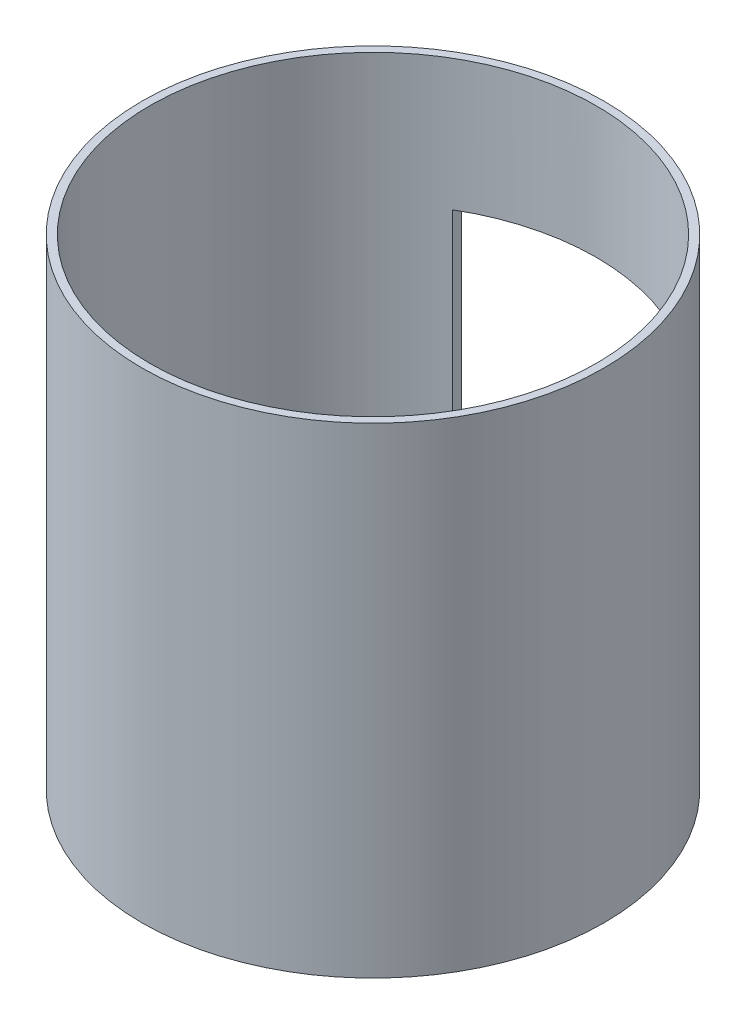
ISO-10303-21;
HEADER;
FILE_DESCRIPTION(('STEP AP214'),'2;1');
FILE_NAME('part.step','',(''),(''),'','','');
FILE_SCHEMA(('AUTOMOTIVE_DESIGN { 1 0 10303 214 1 1 1 1 }'));
ENDSEC;
DATA;
#1=APPLICATION_CONTEXT('core data for automotive mechanical design processes');
#2=APPLICATION_PROTOCOL_DEFINITION('international standard','automotive_design',2000,#1);
#3=PRODUCT_CONTEXT('',#1,'mechanical');
#4=PRODUCT('Part','Part','',(#3));
#5=PRODUCT_RELATED_PRODUCT_CATEGORY('part','',(#4));
#6=PRODUCT_DEFINITION_FORMATION('','',#4);
#7=PRODUCT_DEFINITION_CONTEXT('part definition',#1,'design');
#8=PRODUCT_DEFINITION('design','',#6,#7);
#9=PRODUCT_DEFINITION_SHAPE('','',#8);
#10=(LENGTH_UNIT() NAMED_UNIT(*) SI_UNIT(.MILLI.,.METRE.));
#11=(NAMED_UNIT(*) PLANE_ANGLE_UNIT() SI_UNIT($,.RADIAN.));
#12=(NAMED_UNIT(*) SI_UNIT($,.STERADIAN.) SOLID_ANGLE_UNIT());
#13=UNCERTAINTY_MEASURE_WITH_UNIT(LENGTH_MEASURE(1.E-05),#10,'distance_accuracy_value','');
#14=(GEOMETRIC_REPRESENTATION_CONTEXT(3) GLOBAL_UNCERTAINTY_ASSIGNED_CONTEXT((#13)) GLOBAL_UNIT_ASSIGNED_CONTEXT((#10,
#11,#12)) REPRESENTATION_CONTEXT('',''));
#15=CARTESIAN_POINT('',(0.,0.,0.));
#16=DIRECTION('',(0.,0.,1.));
#17=DIRECTION('',(1.,0.,0.));
#18=AXIS2_PLACEMENT_3D('',#15,#16,#17);
#19=CARTESIAN_POINT('',(0.,0.,0.));
#20=DIRECTION('',(0.,1.,0.));
#21=DIRECTION('',(0.,0.,1.));
#22=AXIS2_PLACEMENT_3D('',#19,#20,#21);
#23=PLANE('',#22);
#24=CARTESIAN_POINT('',(0.,0.,0.));
#25=DIRECTION('',(0.,1.,0.));
#26=DIRECTION('',(0.,0.,1.));
#27=AXIS2_PLACEMENT_3D('',#24,#25,#26);
#28=CIRCLE('',#27,85.);
#29=CARTESIAN_POINT('',(0.,0.,85.));
#30=VERTEX_POINT('',#29);
#31=EDGE_CURVE('E371',#30,#30,#28,.T.);
#32=ORIENTED_EDGE('',*,*,#31,.T.);
#33=EDGE_LOOP('',(#32));
#34=FACE_BOUND('',#33,.T.);
#35=DIRECTION('',(1.,0.,0.));
#36=VECTOR('',#35,1.);
#37=CARTESIAN_POINT('',(0.,0.,27.5926707036758));
#38=LINE('',#37,#36);
#39=CARTESIAN_POINT('',(22.,0.,27.5926707036758));
#40=VERTEX_POINT('',#39);
#41=CARTESIAN_POINT('',(25.,0.,27.5926707036758));
#42=VERTEX_POINT('',#41);
#43=EDGE_CURVE('E11',#40,#42,#38,.T.);
#44=ORIENTED_EDGE('',*,*,#43,.F.);
#45=DIRECTION('',(0.,0.,-1.));
#46=VECTOR('',#45,1.);
#47=CARTESIAN_POINT('',(22.,0.,0.));
#48=LINE('',#47,#46);
#49=CARTESIAN_POINT('',(22.,0.,25.));
#50=VERTEX_POINT('',#49);
#51=EDGE_CURVE('E187',#40,#50,#48,.T.);
#52=ORIENTED_EDGE('',*,*,#51,.T.);
#53=DIRECTION('',(1.,0.,0.));
#54=VECTOR('',#53,1.);
#55=CARTESIAN_POINT('',(25.,0.,25.));
#56=LINE('',#55,#54);
#57=CARTESIAN_POINT('',(-25.,0.,25.));
#58=VERTEX_POINT('',#57);
#59=EDGE_CURVE('E316',#58,#50,#56,.T.);
#60=ORIENTED_EDGE('',*,*,#59,.F.);
#61=DIRECTION('',(0.,0.,1.));
#62=VECTOR('',#61,1.);
#63=CARTESIAN_POINT('',(-25.,0.,25.));
#64=LINE('',#63,#62);
#65=CARTESIAN_POINT('',(-25.,0.,-25.));
#66=VERTEX_POINT('',#65);
#67=EDGE_CURVE('E297',#66,#58,#64,.T.);
#68=ORIENTED_EDGE('',*,*,#67,.F.);
#69=DIRECTION('',(-1.,0.,0.));
#70=VECTOR('',#69,1.);
#71=CARTESIAN_POINT('',(0.,0.,-25.));
#72=LINE('',#71,#70);
#73=CARTESIAN_POINT('',(22.,0.,-25.));
#74=VERTEX_POINT('',#73);
#75=EDGE_CURVE('E303',#74,#66,#72,.T.);
#76=ORIENTED_EDGE('',*,*,#75,.F.);
#77=CARTESIAN_POINT('',(22.,0.,-27.4252060086162));
#78=VERTEX_POINT('',#77);
#79=EDGE_CURVE('E59',#74,#78,#48,.T.);
#80=ORIENTED_EDGE('',*,*,#79,.T.);
#81=DIRECTION('',(-1.,0.,0.));
#82=VECTOR('',#81,1.);
#83=CARTESIAN_POINT('',(0.,0.,-27.4252060086162));
#84=LINE('',#83,#82);
#85=CARTESIAN_POINT('',(25.,0.,-27.4252060086162));
#86=VERTEX_POINT('',#85);
#87=EDGE_CURVE('E52',#86,#78,#84,.T.);
#88=ORIENTED_EDGE('',*,*,#87,.F.);
#89=DIRECTION('',(0.,0.,-1.));
#90=VECTOR('',#89,1.);
#91=CARTESIAN_POINT('',(25.,0.,-25.));
#92=LINE('',#91,#90);
#93=EDGE_CURVE('E320',#42,#86,#92,.T.);
#94=ORIENTED_EDGE('',*,*,#93,.F.);
#95=EDGE_LOOP('',(#44,#52,#60,#68,#76,#80,#88,#94));
#96=FACE_BOUND('',#95,.T.);
#97=ADVANCED_FACE('F43',(#34,#96),#23,.T.);
#98=DIRECTION('',(1.,0.,0.));
#99=VECTOR('',#98,1.);
#100=CARTESIAN_POINT('',(-23.5,0.,23.5));
#101=LINE('',#100,#99);
#102=CARTESIAN_POINT('',(-23.5,0.,23.5));
#103=VERTEX_POINT('',#102);
#104=CARTESIAN_POINT('',(22.,0.,23.5));
#105=VERTEX_POINT('',#104);
#106=EDGE_CURVE('E263',#103,#105,#101,.T.);
#107=ORIENTED_EDGE('',*,*,#106,.T.);
#108=DIRECTION('',(0.,0.,-1.));
#109=VECTOR('',#108,1.);
#110=CARTESIAN_POINT('',(22.,0.,0.));
#111=LINE('',#110,#109);
#112=CARTESIAN_POINT('',(22.,0.,-23.5));
#113=VERTEX_POINT('',#112);
#114=EDGE_CURVE('E400',#105,#113,#111,.T.);
#115=ORIENTED_EDGE('',*,*,#114,.T.);
#116=DIRECTION('',(-1.,0.,0.));
#117=VECTOR('',#116,1.);
#118=CARTESIAN_POINT('',(-23.5,0.,-23.5));
#119=LINE('',#118,#117);
#120=CARTESIAN_POINT('',(-23.5,0.,-23.5));
#121=VERTEX_POINT('',#120);
#122=EDGE_CURVE('E258',#113,#121,#119,.T.);
#123=ORIENTED_EDGE('',*,*,#122,.T.);
#124=DIRECTION('',(0.,0.,1.));
#125=VECTOR('',#124,1.);
#126=CARTESIAN_POINT('',(-23.5,0.,-23.5));
#127=LINE('',#126,#125);
#128=EDGE_CURVE('E276',#121,#103,#127,.T.);
#129=ORIENTED_EDGE('',*,*,#128,.T.);
#130=EDGE_LOOP('',(#107,#115,#123,#129));
#131=FACE_BOUND('',#130,.T.);
#132=ADVANCED_FACE('F447',(#131),#23,.T.);
#133=CARTESIAN_POINT('',(0.,180.,0.));
#134=DIRECTION('',(0.,-1.,0.));
#135=DIRECTION('',(0.,0.,-1.));
#136=AXIS2_PLACEMENT_3D('',#133,#134,#135);
#137=CYLINDRICAL_SURFACE('',#136,88.);
#138=CARTESIAN_POINT('',(0.,130.,0.));
#139=DIRECTION('',(0.,1.,0.));
#140=DIRECTION('',(0.,0.,1.));
#141=AXIS2_PLACEMENT_3D('',#138,#139,#140);
#142=CIRCLE('',#141,88.);
#143=CARTESIAN_POINT('',(43.,130.,-76.7789033524184));
#144=VERTEX_POINT('',#143);
#145=CARTESIAN_POINT('',(-43.,130.,-76.7789033524184));
#146=VERTEX_POINT('',#145);
#147=EDGE_CURVE('E363',#144,#146,#142,.T.);
#148=ORIENTED_EDGE('',*,*,#147,.T.);
#149=DIRECTION('',(0.,-1.,0.));
#150=VECTOR('',#149,1.);
#151=CARTESIAN_POINT('',(-43.,180.,-76.7789033524184));
#152=LINE('',#151,#150);
#153=CARTESIAN_POINT('',(-43.,20.,-76.7789033524184));
#154=VERTEX_POINT('',#153);
#155=EDGE_CURVE('E367',#146,#154,#152,.T.);
#156=ORIENTED_EDGE('',*,*,#155,.T.);
#157=CARTESIAN_POINT('',(0.,20.,0.));
#158=DIRECTION('',(0.,-1.,0.));
#159=DIRECTION('',(0.,0.,-1.));
#160=AXIS2_PLACEMENT_3D('',#157,#158,#159);
#161=CIRCLE('',#160,88.);
#162=CARTESIAN_POINT('',(43.,20.,-76.7789033524184));
#163=VERTEX_POINT('',#162);
#164=EDGE_CURVE('E345',#154,#163,#161,.T.);
#165=ORIENTED_EDGE('',*,*,#164,.T.);
#166=DIRECTION('',(0.,-1.,0.));
#167=VECTOR('',#166,1.);
#168=CARTESIAN_POINT('',(43.,180.,-76.7789033524184));
#169=LINE('',#168,#167);
#170=EDGE_CURVE('E359',#163,#144,#169,.F.);
#171=ORIENTED_EDGE('',*,*,#170,.T.);
#172=EDGE_LOOP('',(#148,#156,#165,#171));
#173=FACE_BOUND('',#172,.T.);
#174=CARTESIAN_POINT('',(0.,180.,0.));
#175=DIRECTION('',(0.,1.,0.));
#176=DIRECTION('',(0.,0.,1.));
#177=AXIS2_PLACEMENT_3D('',#174,#175,#176);
#178=CIRCLE('',#177,88.);
#179=CARTESIAN_POINT('',(0.,180.,88.));
#180=VERTEX_POINT('',#179);
#181=EDGE_CURVE('E383',#180,#180,#178,.T.);
#182=ORIENTED_EDGE('',*,*,#181,.F.);
#183=EDGE_LOOP('',(#182));
#184=FACE_BOUND('',#183,.T.);
#185=CARTESIAN_POINT('',(0.,-3.,0.));
#186=DIRECTION('',(0.,1.,0.));
#187=DIRECTION('',(0.,0.,1.));
#188=AXIS2_PLACEMENT_3D('',#185,#186,#187);
#189=CIRCLE('',#188,88.);
#190=CARTESIAN_POINT('',(0.,-3.,88.));
#191=VERTEX_POINT('',#190);
#192=EDGE_CURVE('E376',#191,#191,#189,.T.);
#193=ORIENTED_EDGE('',*,*,#192,.T.);
#194=EDGE_LOOP('',(#193));
#195=FACE_BOUND('',#194,.T.);
#196=ADVANCED_FACE('F476',(#173,#184,#195),#137,.T.);
#197=CARTESIAN_POINT('',(0.,180.,0.));
#198=DIRECTION('',(0.,1.,0.));
#199=DIRECTION('',(0.,0.,1.));
#200=AXIS2_PLACEMENT_3D('',#197,#198,#199);
#201=PLANE('',#200);
#202=CARTESIAN_POINT('',(0.,180.,0.));
#203=DIRECTION('',(0.,1.,0.));
#204=DIRECTION('',(0.,0.,1.));
#205=AXIS2_PLACEMENT_3D('',#202,#203,#204);
#206=CIRCLE('',#205,85.);
#207=CARTESIAN_POINT('',(0.,180.,85.));
#208=VERTEX_POINT('',#207);
#209=EDGE_CURVE('E372',#208,#208,#206,.T.);
#210=ORIENTED_EDGE('',*,*,#209,.F.);
#211=EDGE_LOOP('',(#210));
#212=FACE_BOUND('',#211,.T.);
#213=ORIENTED_EDGE('',*,*,#181,.T.);
#214=EDGE_LOOP('',(#213));
#215=FACE_BOUND('',#214,.T.);
#216=ADVANCED_FACE('F485',(#212,#215),#201,.T.);
#217=CARTESIAN_POINT('',(0.,-3.,0.));
#218=DIRECTION('',(0.,1.,0.));
#219=DIRECTION('',(0.,0.,1.));
#220=AXIS2_PLACEMENT_3D('',#217,#218,#219);
#221=PLANE('',#220);
#222=ORIENTED_EDGE('',*,*,#192,.F.);
#223=EDGE_LOOP('',(#222));
#224=FACE_BOUND('',#223,.T.);
#225=ADVANCED_FACE('F45',(#224),#221,.F.);
#226=CARTESIAN_POINT('',(0.,180.,0.));
#227=DIRECTION('',(0.,-1.,0.));
#228=DIRECTION('',(0.,0.,-1.));
#229=AXIS2_PLACEMENT_3D('',#226,#227,#228);
#230=CYLINDRICAL_SURFACE('',#229,85.);
#231=DIRECTION('',(0.,-1.,0.));
#232=VECTOR('',#231,1.);
#233=CARTESIAN_POINT('',(-43.,180.,-73.3212111192935));
#234=LINE('',#233,#232);
#235=CARTESIAN_POINT('',(-43.,130.,-73.3212111192934));
#236=VERTEX_POINT('',#235);
#237=CARTESIAN_POINT('',(-43.,20.,-73.3212111192934));
#238=VERTEX_POINT('',#237);
#239=EDGE_CURVE('E396',#236,#238,#234,.T.);
#240=ORIENTED_EDGE('',*,*,#239,.F.);
#241=CARTESIAN_POINT('',(0.,130.,0.));
#242=DIRECTION('',(0.,1.,0.));
#243=DIRECTION('',(0.,0.,1.));
#244=AXIS2_PLACEMENT_3D('',#241,#242,#243);
#245=CIRCLE('',#244,85.);
#246=CARTESIAN_POINT('',(43.,130.,-73.3212111192935));
#247=VERTEX_POINT('',#246);
#248=EDGE_CURVE('E393',#247,#236,#245,.T.);
#249=ORIENTED_EDGE('',*,*,#248,.F.);
#250=DIRECTION('',(0.,-1.,0.));
#251=VECTOR('',#250,1.);
#252=CARTESIAN_POINT('',(43.,180.,-73.3212111192935));
#253=LINE('',#252,#251);
#254=CARTESIAN_POINT('',(43.,20.,-73.3212111192934));
#255=VERTEX_POINT('',#254);
#256=EDGE_CURVE('E390',#255,#247,#253,.F.);
#257=ORIENTED_EDGE('',*,*,#256,.F.);
#258=CARTESIAN_POINT('',(0.,20.,0.));
#259=DIRECTION('',(0.,-1.,0.));
#260=DIRECTION('',(0.,0.,-1.));
#261=AXIS2_PLACEMENT_3D('',#258,#259,#260);
#262=CIRCLE('',#261,85.);
#263=EDGE_CURVE('E387',#238,#255,#262,.T.);
#264=ORIENTED_EDGE('',*,*,#263,.F.);
#265=EDGE_LOOP('',(#240,#249,#257,#264));
#266=FACE_BOUND('',#265,.T.);
#267=ORIENTED_EDGE('',*,*,#209,.T.);
#268=EDGE_LOOP('',(#267));
#269=FACE_BOUND('',#268,.T.);
#270=ORIENTED_EDGE('',*,*,#31,.F.);
#271=EDGE_LOOP('',(#270));
#272=FACE_BOUND('',#271,.T.);
#273=ADVANCED_FACE('F481',(#266,#269,#272),#230,.F.);
#274=CARTESIAN_POINT('',(-43.,130.,-180.));
#275=DIRECTION('',(-1.,0.,0.));
#276=DIRECTION('',(0.,0.,1.));
#277=AXIS2_PLACEMENT_3D('',#274,#275,#276);
#278=PLANE('',#277);
#279=DIRECTION('',(0.,0.,1.));
#280=VECTOR('',#279,1.);
#281=CARTESIAN_POINT('',(-43.,130.,-180.));
#282=LINE('',#281,#280);
#283=EDGE_CURVE('E341',#146,#236,#282,.T.);
#284=ORIENTED_EDGE('',*,*,#283,.T.);
#285=ORIENTED_EDGE('',*,*,#239,.T.);
#286=DIRECTION('',(0.,0.,1.));
#287=VECTOR('',#286,1.);
#288=CARTESIAN_POINT('',(-43.,20.,-180.));
#289=LINE('',#288,#287);
#290=EDGE_CURVE('E340',#154,#238,#289,.T.);
#291=ORIENTED_EDGE('',*,*,#290,.F.);
#292=ORIENTED_EDGE('',*,*,#155,.F.);
#293=EDGE_LOOP('',(#284,#285,#291,#292));
#294=FACE_BOUND('',#293,.T.);
#295=ADVANCED_FACE('F479',(#294),#278,.F.);
#296=CARTESIAN_POINT('',(43.,130.,-180.));
#297=DIRECTION('',(0.,1.,0.));
#298=DIRECTION('',(0.,0.,1.));
#299=AXIS2_PLACEMENT_3D('',#296,#297,#298);
#300=PLANE('',#299);
#301=DIRECTION('',(0.,0.,1.));
#302=VECTOR('',#301,1.);
#303=CARTESIAN_POINT('',(43.,130.,-180.));
#304=LINE('',#303,#302);
#305=EDGE_CURVE('E346',#144,#247,#304,.T.);
#306=ORIENTED_EDGE('',*,*,#305,.T.);
#307=ORIENTED_EDGE('',*,*,#248,.T.);
#308=ORIENTED_EDGE('',*,*,#283,.F.);
#309=ORIENTED_EDGE('',*,*,#147,.F.);
#310=EDGE_LOOP('',(#306,#307,#308,#309));
#311=FACE_BOUND('',#310,.T.);
#312=ADVANCED_FACE('F512',(#311),#300,.F.);
#313=CARTESIAN_POINT('',(43.,20.,-180.));
#314=DIRECTION('',(1.,0.,0.));
#315=DIRECTION('',(0.,0.,-1.));
#316=AXIS2_PLACEMENT_3D('',#313,#314,#315);
#317=PLANE('',#316);
#318=DIRECTION('',(0.,0.,1.));
#319=VECTOR('',#318,1.);
#320=CARTESIAN_POINT('',(43.,20.,-180.));
#321=LINE('',#320,#319);
#322=EDGE_CURVE('E350',#163,#255,#321,.T.);
#323=ORIENTED_EDGE('',*,*,#322,.T.);
#324=ORIENTED_EDGE('',*,*,#256,.T.);
#325=ORIENTED_EDGE('',*,*,#305,.F.);
#326=ORIENTED_EDGE('',*,*,#170,.F.);
#327=EDGE_LOOP('',(#323,#324,#325,#326));
#328=FACE_BOUND('',#327,.T.);
#329=ADVANCED_FACE('F519',(#328),#317,.F.);
#330=CARTESIAN_POINT('',(-43.,20.,-180.));
#331=DIRECTION('',(0.,-1.,0.));
#332=DIRECTION('',(0.,0.,-1.));
#333=AXIS2_PLACEMENT_3D('',#330,#331,#332);
#334=PLANE('',#333);
#335=ORIENTED_EDGE('',*,*,#290,.T.);
#336=ORIENTED_EDGE('',*,*,#263,.T.);
#337=ORIENTED_EDGE('',*,*,#322,.F.);
#338=ORIENTED_EDGE('',*,*,#164,.F.);
#339=EDGE_LOOP('',(#335,#336,#337,#338));
#340=FACE_BOUND('',#339,.T.);
#341=ADVANCED_FACE('F527',(#340),#334,.F.);
#342=CARTESIAN_POINT('',(0.,40.,0.));
#343=DIRECTION('',(0.,-1.,0.));
#344=DIRECTION('',(0.,0.,-1.));
#345=AXIS2_PLACEMENT_3D('',#342,#343,#344);
#346=PLANE('',#345);
#347=DIRECTION('',(-1.,0.,0.));
#348=VECTOR('',#347,1.);
#349=CARTESIAN_POINT('',(-25.,40.,-25.));
#350=LINE('',#349,#348);
#351=CARTESIAN_POINT('',(25.,40.,-25.));
#352=VERTEX_POINT('',#351);
#353=CARTESIAN_POINT('',(-25.,40.,-25.));
#354=VERTEX_POINT('',#353);
#355=EDGE_CURVE('E298',#352,#354,#350,.T.);
#356=ORIENTED_EDGE('',*,*,#355,.T.);
#357=DIRECTION('',(0.,0.,1.));
#358=VECTOR('',#357,1.);
#359=CARTESIAN_POINT('',(-25.,40.,25.));
#360=LINE('',#359,#358);
#361=CARTESIAN_POINT('',(-25.,40.,25.));
#362=VERTEX_POINT('',#361);
#363=EDGE_CURVE('E302',#354,#362,#360,.T.);
#364=ORIENTED_EDGE('',*,*,#363,.T.);
#365=DIRECTION('',(1.,0.,0.));
#366=VECTOR('',#365,1.);
#367=CARTESIAN_POINT('',(25.,40.,25.));
#368=LINE('',#367,#366);
#369=CARTESIAN_POINT('',(25.,40.,25.));
#370=VERTEX_POINT('',#369);
#371=EDGE_CURVE('E306',#362,#370,#368,.T.);
#372=ORIENTED_EDGE('',*,*,#371,.T.);
#373=DIRECTION('',(0.,0.,-1.));
#374=VECTOR('',#373,1.);
#375=CARTESIAN_POINT('',(25.,40.,-25.));
#376=LINE('',#375,#374);
#377=EDGE_CURVE('E309',#370,#352,#376,.T.);
#378=ORIENTED_EDGE('',*,*,#377,.T.);
#379=EDGE_LOOP('',(#356,#364,#372,#378));
#380=FACE_BOUND('',#379,.T.);
#381=DIRECTION('',(0.,0.,-1.));
#382=VECTOR('',#381,1.);
#383=CARTESIAN_POINT('',(23.5,40.,-23.5));
#384=LINE('',#383,#382);
#385=CARTESIAN_POINT('',(23.5,40.,23.5));
#386=VERTEX_POINT('',#385);
#387=CARTESIAN_POINT('',(23.5,40.,-23.5));
#388=VERTEX_POINT('',#387);
#389=EDGE_CURVE('E259',#386,#388,#384,.T.);
#390=ORIENTED_EDGE('',*,*,#389,.F.);
#391=DIRECTION('',(1.,0.,0.));
#392=VECTOR('',#391,1.);
#393=CARTESIAN_POINT('',(-23.5,40.,23.5));
#394=LINE('',#393,#392);
#395=CARTESIAN_POINT('',(-23.5,40.,23.5));
#396=VERTEX_POINT('',#395);
#397=EDGE_CURVE('E270',#396,#386,#394,.T.);
#398=ORIENTED_EDGE('',*,*,#397,.F.);
#399=DIRECTION('',(0.,0.,1.));
#400=VECTOR('',#399,1.);
#401=CARTESIAN_POINT('',(-23.5,40.,-23.5));
#402=LINE('',#401,#400);
#403=CARTESIAN_POINT('',(-23.5,40.,-23.5));
#404=VERTEX_POINT('',#403);
#405=EDGE_CURVE('E266',#404,#396,#402,.T.);
#406=ORIENTED_EDGE('',*,*,#405,.F.);
#407=DIRECTION('',(-1.,0.,0.));
#408=VECTOR('',#407,1.);
#409=CARTESIAN_POINT('',(-23.5,40.,-23.5));
#410=LINE('',#409,#408);
#411=EDGE_CURVE('E262',#388,#404,#410,.T.);
#412=ORIENTED_EDGE('',*,*,#411,.F.);
#413=EDGE_LOOP('',(#390,#398,#406,#412));
#414=FACE_BOUND('',#413,.T.);
#415=ADVANCED_FACE('F422',(#380,#414),#346,.F.);
#416=CARTESIAN_POINT('',(-25.,40.,25.));
#417=DIRECTION('',(1.,0.,0.));
#418=DIRECTION('',(0.,0.,-1.));
#419=AXIS2_PLACEMENT_3D('',#416,#417,#418);
#420=PLANE('',#419);
#421=ORIENTED_EDGE('',*,*,#67,.T.);
#422=DIRECTION('',(0.,-1.,0.));
#423=VECTOR('',#422,1.);
#424=CARTESIAN_POINT('',(-25.,40.,25.));
#425=LINE('',#424,#423);
#426=EDGE_CURVE('E332',#362,#58,#425,.T.);
#427=ORIENTED_EDGE('',*,*,#426,.F.);
#428=ORIENTED_EDGE('',*,*,#363,.F.);
#429=DIRECTION('',(0.,-1.,0.));
#430=VECTOR('',#429,1.);
#431=CARTESIAN_POINT('',(-25.,40.,-25.));
#432=LINE('',#431,#430);
#433=EDGE_CURVE('E336',#354,#66,#432,.T.);
#434=ORIENTED_EDGE('',*,*,#433,.T.);
#435=EDGE_LOOP('',(#421,#427,#428,#434));
#436=FACE_BOUND('',#435,.T.);
#437=ADVANCED_FACE('F418',(#436),#420,.F.);
#438=CARTESIAN_POINT('',(25.,40.,25.));
#439=DIRECTION('',(0.,0.,-1.));
#440=DIRECTION('',(-1.,0.,0.));
#441=AXIS2_PLACEMENT_3D('',#438,#439,#440);
#442=PLANE('',#441);
#443=DIRECTION('',(0.,-1.,0.));
#444=VECTOR('',#443,1.);
#445=CARTESIAN_POINT('',(22.,40.,25.));
#446=LINE('',#445,#444);
#447=CARTESIAN_POINT('',(22.,10.2065389127508,25.));
#448=VERTEX_POINT('',#447);
#449=EDGE_CURVE('E241',#448,#50,#446,.T.);
#450=ORIENTED_EDGE('',*,*,#449,.F.);
#451=DIRECTION('',(1.,0.,0.));
#452=VECTOR('',#451,1.);
#453=CARTESIAN_POINT('',(25.,10.2065389127508,25.));
#454=LINE('',#453,#452);
#455=CARTESIAN_POINT('',(25.,10.2065389127508,25.));
#456=VERTEX_POINT('',#455);
#457=EDGE_CURVE('E254',#448,#456,#454,.T.);
#458=ORIENTED_EDGE('',*,*,#457,.T.);
#459=DIRECTION('',(0.,-1.,0.));
#460=VECTOR('',#459,1.);
#461=CARTESIAN_POINT('',(25.,40.,25.));
#462=LINE('',#461,#460);
#463=EDGE_CURVE('E328',#370,#456,#462,.T.);
#464=ORIENTED_EDGE('',*,*,#463,.F.);
#465=ORIENTED_EDGE('',*,*,#371,.F.);
#466=ORIENTED_EDGE('',*,*,#426,.T.);
#467=ORIENTED_EDGE('',*,*,#59,.T.);
#468=EDGE_LOOP('',(#450,#458,#464,#465,#466,#467));
#469=FACE_BOUND('',#468,.T.);
#470=ADVANCED_FACE('F436',(#469),#442,.F.);
#471=CARTESIAN_POINT('',(25.,40.,-25.));
#472=DIRECTION('',(-1.,0.,0.));
#473=DIRECTION('',(0.,0.,1.));
#474=AXIS2_PLACEMENT_3D('',#471,#472,#473);
#475=PLANE('',#474);
#476=ORIENTED_EDGE('',*,*,#463,.T.);
#477=DIRECTION('',(0.,0.,1.));
#478=VECTOR('',#477,1.);
#479=CARTESIAN_POINT('',(25.,10.2065389127508,-27.4252060086162));
#480=LINE('',#479,#478);
#481=CARTESIAN_POINT('',(25.,10.2065389127508,-25.));
#482=VERTEX_POINT('',#481);
#483=EDGE_CURVE('E191',#482,#456,#480,.T.);
#484=ORIENTED_EDGE('',*,*,#483,.F.);
#485=DIRECTION('',(0.,-1.,0.));
#486=VECTOR('',#485,1.);
#487=CARTESIAN_POINT('',(25.,40.,-25.));
#488=LINE('',#487,#486);
#489=EDGE_CURVE('E313',#352,#482,#488,.T.);
#490=ORIENTED_EDGE('',*,*,#489,.F.);
#491=ORIENTED_EDGE('',*,*,#377,.F.);
#492=EDGE_LOOP('',(#476,#484,#490,#491));
#493=FACE_BOUND('',#492,.T.);
#494=ADVANCED_FACE('F428',(#493),#475,.F.);
#495=CARTESIAN_POINT('',(0.,40.,-25.));
#496=DIRECTION('',(0.,0.,1.));
#497=DIRECTION('',(1.,0.,0.));
#498=AXIS2_PLACEMENT_3D('',#495,#496,#497);
#499=PLANE('',#498);
#500=ORIENTED_EDGE('',*,*,#489,.T.);
#501=DIRECTION('',(-1.,0.,0.));
#502=VECTOR('',#501,1.);
#503=CARTESIAN_POINT('',(0.,10.2065389127508,-25.));
#504=LINE('',#503,#502);
#505=CARTESIAN_POINT('',(22.,10.2065389127508,-25.));
#506=VERTEX_POINT('',#505);
#507=EDGE_CURVE('E250',#482,#506,#504,.T.);
#508=ORIENTED_EDGE('',*,*,#507,.T.);
#509=DIRECTION('',(0.,1.,0.));
#510=VECTOR('',#509,1.);
#511=CARTESIAN_POINT('',(22.,40.,-25.));
#512=LINE('',#511,#510);
#513=EDGE_CURVE('E236',#74,#506,#512,.T.);
#514=ORIENTED_EDGE('',*,*,#513,.F.);
#515=ORIENTED_EDGE('',*,*,#75,.T.);
#516=ORIENTED_EDGE('',*,*,#433,.F.);
#517=ORIENTED_EDGE('',*,*,#355,.F.);
#518=EDGE_LOOP('',(#500,#508,#514,#515,#516,#517));
#519=FACE_BOUND('',#518,.T.);
#520=ADVANCED_FACE('F416',(#519),#499,.F.);
#521=CARTESIAN_POINT('',(23.5,40.,-23.5));
#522=DIRECTION('',(-1.,0.,0.));
#523=DIRECTION('',(0.,0.,1.));
#524=AXIS2_PLACEMENT_3D('',#521,#522,#523);
#525=PLANE('',#524);
#526=DIRECTION('',(0.,0.,-1.));
#527=VECTOR('',#526,1.);
#528=CARTESIAN_POINT('',(23.5,10.2065389127508,-23.5));
#529=LINE('',#528,#527);
#530=CARTESIAN_POINT('',(23.5,10.2065389127508,23.5));
#531=VERTEX_POINT('',#530);
#532=CARTESIAN_POINT('',(23.5,10.2065389127508,-23.5));
#533=VERTEX_POINT('',#532);
#534=EDGE_CURVE('E244',#531,#533,#529,.T.);
#535=ORIENTED_EDGE('',*,*,#534,.F.);
#536=DIRECTION('',(0.,-1.,0.));
#537=VECTOR('',#536,1.);
#538=CARTESIAN_POINT('',(23.5,40.,23.5));
#539=LINE('',#538,#537);
#540=EDGE_CURVE('E273',#386,#531,#539,.T.);
#541=ORIENTED_EDGE('',*,*,#540,.F.);
#542=ORIENTED_EDGE('',*,*,#389,.T.);
#543=DIRECTION('',(0.,-1.,0.));
#544=VECTOR('',#543,1.);
#545=CARTESIAN_POINT('',(23.5,40.,-23.5));
#546=LINE('',#545,#544);
#547=EDGE_CURVE('E293',#388,#533,#546,.T.);
#548=ORIENTED_EDGE('',*,*,#547,.T.);
#549=EDGE_LOOP('',(#535,#541,#542,#548));
#550=FACE_BOUND('',#549,.T.);
#551=ADVANCED_FACE('F455',(#550),#525,.T.);
#552=CARTESIAN_POINT('',(-23.5,40.,-23.5));
#553=DIRECTION('',(0.,0.,1.));
#554=DIRECTION('',(1.,0.,0.));
#555=AXIS2_PLACEMENT_3D('',#552,#553,#554);
#556=PLANE('',#555);
#557=DIRECTION('',(-1.,0.,0.));
#558=VECTOR('',#557,1.);
#559=CARTESIAN_POINT('',(-23.5,10.2065389127508,-23.5));
#560=LINE('',#559,#558);
#561=CARTESIAN_POINT('',(22.,10.2065389127508,-23.5));
#562=VERTEX_POINT('',#561);
#563=EDGE_CURVE('E247',#533,#562,#560,.T.);
#564=ORIENTED_EDGE('',*,*,#563,.F.);
#565=ORIENTED_EDGE('',*,*,#547,.F.);
#566=ORIENTED_EDGE('',*,*,#411,.T.);
#567=DIRECTION('',(0.,-1.,0.));
#568=VECTOR('',#567,1.);
#569=CARTESIAN_POINT('',(-23.5,40.,-23.5));
#570=LINE('',#569,#568);
#571=EDGE_CURVE('E289',#404,#121,#570,.T.);
#572=ORIENTED_EDGE('',*,*,#571,.T.);
#573=ORIENTED_EDGE('',*,*,#122,.F.);
#574=DIRECTION('',(0.,1.,0.));
#575=VECTOR('',#574,1.);
#576=CARTESIAN_POINT('',(22.,40.,-23.5));
#577=LINE('',#576,#575);
#578=EDGE_CURVE('E66',#113,#562,#577,.T.);
#579=ORIENTED_EDGE('',*,*,#578,.T.);
#580=EDGE_LOOP('',(#564,#565,#566,#572,#573,#579));
#581=FACE_BOUND('',#580,.T.);
#582=ADVANCED_FACE('F442',(#581),#556,.T.);
#583=CARTESIAN_POINT('',(-23.5,40.,-23.5));
#584=DIRECTION('',(1.,0.,0.));
#585=DIRECTION('',(0.,0.,-1.));
#586=AXIS2_PLACEMENT_3D('',#583,#584,#585);
#587=PLANE('',#586);
#588=ORIENTED_EDGE('',*,*,#128,.F.);
#589=ORIENTED_EDGE('',*,*,#571,.F.);
#590=ORIENTED_EDGE('',*,*,#405,.T.);
#591=DIRECTION('',(0.,-1.,0.));
#592=VECTOR('',#591,1.);
#593=CARTESIAN_POINT('',(-23.5,40.,23.5));
#594=LINE('',#593,#592);
#595=EDGE_CURVE('E285',#396,#103,#594,.T.);
#596=ORIENTED_EDGE('',*,*,#595,.T.);
#597=EDGE_LOOP('',(#588,#589,#590,#596));
#598=FACE_BOUND('',#597,.T.);
#599=ADVANCED_FACE('F461',(#598),#587,.T.);
#600=CARTESIAN_POINT('',(-23.5,40.,23.5));
#601=DIRECTION('',(0.,0.,-1.));
#602=DIRECTION('',(-1.,0.,0.));
#603=AXIS2_PLACEMENT_3D('',#600,#601,#602);
#604=PLANE('',#603);
#605=DIRECTION('',(1.,0.,0.));
#606=VECTOR('',#605,1.);
#607=CARTESIAN_POINT('',(-23.5,10.2065389127508,23.5));
#608=LINE('',#607,#606);
#609=CARTESIAN_POINT('',(22.,10.2065389127508,23.5));
#610=VERTEX_POINT('',#609);
#611=EDGE_CURVE('E403',#610,#531,#608,.T.);
#612=ORIENTED_EDGE('',*,*,#611,.F.);
#613=DIRECTION('',(0.,-1.,0.));
#614=VECTOR('',#613,1.);
#615=CARTESIAN_POINT('',(22.,40.,23.5));
#616=LINE('',#615,#614);
#617=EDGE_CURVE('E229',#610,#105,#616,.T.);
#618=ORIENTED_EDGE('',*,*,#617,.T.);
#619=ORIENTED_EDGE('',*,*,#106,.F.);
#620=ORIENTED_EDGE('',*,*,#595,.F.);
#621=ORIENTED_EDGE('',*,*,#397,.T.);
#622=ORIENTED_EDGE('',*,*,#540,.T.);
#623=EDGE_LOOP('',(#612,#618,#619,#620,#621,#622));
#624=FACE_BOUND('',#623,.T.);
#625=ADVANCED_FACE('F451',(#624),#604,.T.);
#626=CARTESIAN_POINT('',(22.,10.2065389127508,-27.4252060086162));
#627=DIRECTION('',(0.,1.,0.));
#628=DIRECTION('',(0.,0.,1.));
#629=AXIS2_PLACEMENT_3D('',#626,#627,#628);
#630=PLANE('',#629);
#631=DIRECTION('',(0.,0.,1.));
#632=VECTOR('',#631,1.);
#633=CARTESIAN_POINT('',(22.,10.2065389127508,-27.4252060086162));
#634=LINE('',#633,#632);
#635=EDGE_CURVE('E211',#610,#448,#634,.T.);
#636=ORIENTED_EDGE('',*,*,#635,.F.);
#637=ORIENTED_EDGE('',*,*,#611,.T.);
#638=ORIENTED_EDGE('',*,*,#534,.T.);
#639=ORIENTED_EDGE('',*,*,#563,.T.);
#640=EDGE_CURVE('E203',#506,#562,#634,.T.);
#641=ORIENTED_EDGE('',*,*,#640,.F.);
#642=ORIENTED_EDGE('',*,*,#507,.F.);
#643=ORIENTED_EDGE('',*,*,#483,.T.);
#644=ORIENTED_EDGE('',*,*,#457,.F.);
#645=EDGE_LOOP('',(#636,#637,#638,#639,#641,#642,#643,#644));
#646=FACE_BOUND('',#645,.T.);
#647=ADVANCED_FACE('F432',(#646),#630,.F.);
#648=CARTESIAN_POINT('',(22.,10.2065389127508,27.5926707036758));
#649=DIRECTION('',(0.,0.,1.));
#650=DIRECTION('',(1.,0.,0.));
#651=AXIS2_PLACEMENT_3D('',#648,#649,#650);
#652=PLANE('',#651);
#653=ORIENTED_EDGE('',*,*,#43,.T.);
#654=DIRECTION('',(0.,-1.,0.));
#655=VECTOR('',#654,1.);
#656=CARTESIAN_POINT('',(25.,10.2065389127508,27.5926707036758));
#657=LINE('',#656,#655);
#658=CARTESIAN_POINT('',(25.,-1.79346108724924,27.5926707036758));
#659=VERTEX_POINT('',#658);
#660=EDGE_CURVE('E197',#42,#659,#657,.T.);
#661=ORIENTED_EDGE('',*,*,#660,.T.);
#662=DIRECTION('',(1.,0.,0.));
#663=VECTOR('',#662,1.);
#664=CARTESIAN_POINT('',(22.,-1.79346108724924,27.5926707036758));
#665=LINE('',#664,#663);
#666=CARTESIAN_POINT('',(22.,-1.79346108724924,27.5926707036758));
#667=VERTEX_POINT('',#666);
#668=EDGE_CURVE('E194',#667,#659,#665,.T.);
#669=ORIENTED_EDGE('',*,*,#668,.F.);
#670=DIRECTION('',(0.,-1.,0.));
#671=VECTOR('',#670,1.);
#672=CARTESIAN_POINT('',(22.,10.2065389127508,27.5926707036758));
#673=LINE('',#672,#671);
#674=EDGE_CURVE('E181',#40,#667,#673,.T.);
#675=ORIENTED_EDGE('',*,*,#674,.F.);
#676=EDGE_LOOP('',(#653,#661,#669,#675));
#677=FACE_BOUND('',#676,.T.);
#678=ADVANCED_FACE('F195',(#677),#652,.F.);
#679=CARTESIAN_POINT('',(22.,-1.79346108724924,-27.4252060086162));
#680=DIRECTION('',(0.,0.,-1.));
#681=DIRECTION('',(-1.,0.,0.));
#682=AXIS2_PLACEMENT_3D('',#679,#680,#681);
#683=PLANE('',#682);
#684=ORIENTED_EDGE('',*,*,#87,.T.);
#685=DIRECTION('',(0.,1.,0.));
#686=VECTOR('',#685,1.);
#687=CARTESIAN_POINT('',(22.,-1.79346108724924,-27.4252060086162));
#688=LINE('',#687,#686);
#689=CARTESIAN_POINT('',(22.,-1.79346108724924,-27.4252060086162));
#690=VERTEX_POINT('',#689);
#691=EDGE_CURVE('E208',#690,#78,#688,.T.);
#692=ORIENTED_EDGE('',*,*,#691,.F.);
#693=DIRECTION('',(1.,0.,0.));
#694=VECTOR('',#693,1.);
#695=CARTESIAN_POINT('',(22.,-1.79346108724924,-27.4252060086162));
#696=LINE('',#695,#694);
#697=CARTESIAN_POINT('',(25.,-1.79346108724924,-27.4252060086162));
#698=VERTEX_POINT('',#697);
#699=EDGE_CURVE('E202',#690,#698,#696,.T.);
#700=ORIENTED_EDGE('',*,*,#699,.T.);
#701=DIRECTION('',(0.,1.,0.));
#702=VECTOR('',#701,1.);
#703=CARTESIAN_POINT('',(25.,-1.79346108724924,-27.4252060086162));
#704=LINE('',#703,#702);
#705=EDGE_CURVE('E222',#698,#86,#704,.T.);
#706=ORIENTED_EDGE('',*,*,#705,.T.);
#707=EDGE_LOOP('',(#684,#692,#700,#706));
#708=FACE_BOUND('',#707,.T.);
#709=ADVANCED_FACE('F408',(#708),#683,.F.);
#710=CARTESIAN_POINT('',(22.,-1.79346108724924,27.5926707036758));
#711=DIRECTION('',(0.,-1.,0.));
#712=DIRECTION('',(0.,0.,-1.));
#713=AXIS2_PLACEMENT_3D('',#710,#711,#712);
#714=PLANE('',#713);
#715=DIRECTION('',(0.,0.,-1.));
#716=VECTOR('',#715,1.);
#717=CARTESIAN_POINT('',(25.,-1.79346108724924,27.5926707036758));
#718=LINE('',#717,#716);
#719=EDGE_CURVE('E219',#659,#698,#718,.T.);
#720=ORIENTED_EDGE('',*,*,#719,.T.);
#721=ORIENTED_EDGE('',*,*,#699,.F.);
#722=DIRECTION('',(0.,0.,-1.));
#723=VECTOR('',#722,1.);
#724=CARTESIAN_POINT('',(22.,-1.79346108724924,27.5926707036758));
#725=LINE('',#724,#723);
#726=EDGE_CURVE('E185',#667,#690,#725,.T.);
#727=ORIENTED_EDGE('',*,*,#726,.F.);
#728=ORIENTED_EDGE('',*,*,#668,.T.);
#729=EDGE_LOOP('',(#720,#721,#727,#728));
#730=FACE_BOUND('',#729,.T.);
#731=ADVANCED_FACE('F205',(#730),#714,.F.);
#732=CARTESIAN_POINT('',(22.,0.,0.));
#733=DIRECTION('',(1.,0.,0.));
#734=DIRECTION('',(0.,0.,-1.));
#735=AXIS2_PLACEMENT_3D('',#732,#733,#734);
#736=PLANE('',#735);
#737=ORIENTED_EDGE('',*,*,#674,.T.);
#738=ORIENTED_EDGE('',*,*,#726,.T.);
#739=ORIENTED_EDGE('',*,*,#691,.T.);
#740=ORIENTED_EDGE('',*,*,#79,.F.);
#741=ORIENTED_EDGE('',*,*,#513,.T.);
#742=ORIENTED_EDGE('',*,*,#640,.T.);
#743=ORIENTED_EDGE('',*,*,#578,.F.);
#744=ORIENTED_EDGE('',*,*,#114,.F.);
#745=ORIENTED_EDGE('',*,*,#617,.F.);
#746=ORIENTED_EDGE('',*,*,#635,.T.);
#747=ORIENTED_EDGE('',*,*,#449,.T.);
#748=ORIENTED_EDGE('',*,*,#51,.F.);
#749=EDGE_LOOP('',(#737,#738,#739,#740,#741,#742,#743,#744,#745,#746,#747,#748));
#750=FACE_BOUND('',#749,.T.);
#751=ADVANCED_FACE('F183',(#750),#736,.T.);
#752=CARTESIAN_POINT('',(25.,0.,0.));
#753=DIRECTION('',(1.,0.,0.));
#754=DIRECTION('',(0.,0.,-1.));
#755=AXIS2_PLACEMENT_3D('',#752,#753,#754);
#756=PLANE('',#755);
#757=ORIENTED_EDGE('',*,*,#660,.F.);
#758=ORIENTED_EDGE('',*,*,#93,.T.);
#759=ORIENTED_EDGE('',*,*,#705,.F.);
#760=ORIENTED_EDGE('',*,*,#719,.F.);
#761=EDGE_LOOP('',(#757,#758,#759,#760));
#762=FACE_BOUND('',#761,.T.);
#763=ADVANCED_FACE('F632',(#762),#756,.F.);
#764=CLOSED_SHELL('',(#97,#132,#196,#216,#225,#273,#295,#312,#329,#341,#415,#437,#470,#494,#520,
#551,#582,#599,#625,#647,#678,#709,#731,#751,#763));
#765=MANIFOLD_SOLID_BREP('B2',#764);
#766=ADVANCED_BREP_SHAPE_REPRESENTATION('',(#18,#765),#14);
#767=SHAPE_DEFINITION_REPRESENTATION(#9,#766);
ENDSEC;
END-ISO-10303-21;
